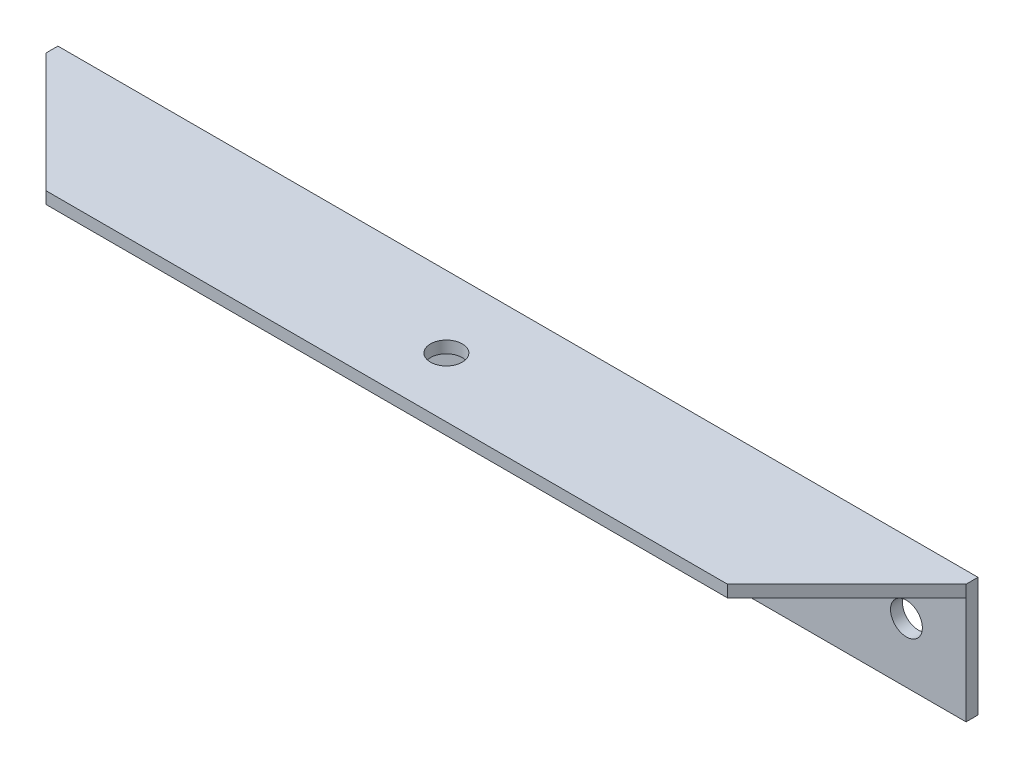
ISO-10303-21;
HEADER;
FILE_DESCRIPTION(('STEP AP214'),'2;1');
FILE_NAME('part.step','',(''),(''),'','','');
FILE_SCHEMA(('AUTOMOTIVE_DESIGN { 1 0 10303 214 1 1 1 1 }'));
ENDSEC;
DATA;
#1=APPLICATION_CONTEXT('core data for automotive mechanical design processes');
#2=APPLICATION_PROTOCOL_DEFINITION('international standard','automotive_design',2000,#1);
#3=PRODUCT_CONTEXT('',#1,'mechanical');
#4=PRODUCT('Part','Part','',(#3));
#5=PRODUCT_RELATED_PRODUCT_CATEGORY('part','',(#4));
#6=PRODUCT_DEFINITION_FORMATION('','',#4);
#7=PRODUCT_DEFINITION_CONTEXT('part definition',#1,'design');
#8=PRODUCT_DEFINITION('design','',#6,#7);
#9=PRODUCT_DEFINITION_SHAPE('','',#8);
#10=(LENGTH_UNIT() NAMED_UNIT(*) SI_UNIT(.MILLI.,.METRE.));
#11=(NAMED_UNIT(*) PLANE_ANGLE_UNIT() SI_UNIT($,.RADIAN.));
#12=(NAMED_UNIT(*) SI_UNIT($,.STERADIAN.) SOLID_ANGLE_UNIT());
#13=UNCERTAINTY_MEASURE_WITH_UNIT(LENGTH_MEASURE(1.E-05),#10,'distance_accuracy_value','');
#14=(GEOMETRIC_REPRESENTATION_CONTEXT(3) GLOBAL_UNCERTAINTY_ASSIGNED_CONTEXT((#13)) GLOBAL_UNIT_ASSIGNED_CONTEXT((#10,
#11,#12)) REPRESENTATION_CONTEXT('',''));
#15=CARTESIAN_POINT('',(0.,0.,0.));
#16=DIRECTION('',(0.,0.,1.));
#17=DIRECTION('',(1.,0.,0.));
#18=AXIS2_PLACEMENT_3D('',#15,#16,#17);
#19=CARTESIAN_POINT('',(115.7,0.,3.));
#20=DIRECTION('',(-1.,0.,0.));
#21=DIRECTION('',(0.,0.,1.));
#22=AXIS2_PLACEMENT_3D('',#19,#20,#21);
#23=PLANE('',#22);
#24=DIRECTION('',(0.,1.,0.));
#25=VECTOR('',#24,1.);
#26=CARTESIAN_POINT('',(115.7,0.,0.));
#27=LINE('',#26,#25);
#28=CARTESIAN_POINT('',(115.7,-30.,0.));
#29=VERTEX_POINT('',#28);
#30=CARTESIAN_POINT('',(115.7,0.,0.));
#31=VERTEX_POINT('',#30);
#32=EDGE_CURVE('E94',#29,#31,#27,.T.);
#33=ORIENTED_EDGE('',*,*,#32,.T.);
#34=DIRECTION('',(0.,0.,-1.));
#35=VECTOR('',#34,1.);
#36=CARTESIAN_POINT('',(115.7,0.,3.));
#37=LINE('',#36,#35);
#38=CARTESIAN_POINT('',(115.7,0.,3.));
#39=VERTEX_POINT('',#38);
#40=EDGE_CURVE('E11',#39,#31,#37,.T.);
#41=ORIENTED_EDGE('',*,*,#40,.F.);
#42=DIRECTION('',(0.,1.,0.));
#43=VECTOR('',#42,1.);
#44=CARTESIAN_POINT('',(115.7,-2.99999999999998,3.));
#45=LINE('',#44,#43);
#46=CARTESIAN_POINT('',(115.7,-2.99999999999998,3.));
#47=VERTEX_POINT('',#46);
#48=EDGE_CURVE('E99',#47,#39,#45,.T.);
#49=ORIENTED_EDGE('',*,*,#48,.F.);
#50=DIRECTION('',(0.,1.,0.));
#51=VECTOR('',#50,1.);
#52=CARTESIAN_POINT('',(115.7,0.,3.));
#53=LINE('',#52,#51);
#54=CARTESIAN_POINT('',(115.7,-30.,3.));
#55=VERTEX_POINT('',#54);
#56=EDGE_CURVE('E88',#55,#47,#53,.T.);
#57=ORIENTED_EDGE('',*,*,#56,.F.);
#58=DIRECTION('',(0.,0.,-1.));
#59=VECTOR('',#58,1.);
#60=CARTESIAN_POINT('',(115.7,-30.,3.));
#61=LINE('',#60,#59);
#62=EDGE_CURVE('E81',#55,#29,#61,.T.);
#63=ORIENTED_EDGE('',*,*,#62,.T.);
#64=EDGE_LOOP('',(#33,#41,#49,#57,#63));
#65=FACE_BOUND('',#64,.T.);
#66=ADVANCED_FACE('F35',(#65),#23,.F.);
#67=CARTESIAN_POINT('',(-115.7,0.,3.));
#68=DIRECTION('',(0.,-1.,0.));
#69=DIRECTION('',(1.,0.,0.));
#70=AXIS2_PLACEMENT_3D('',#67,#68,#69);
#71=PLANE('',#70);
#72=CARTESIAN_POINT('',(0.,0.,17.9999999999998));
#73=DIRECTION('',(0.,1.,0.));
#74=DIRECTION('',(0.,0.,1.));
#75=AXIS2_PLACEMENT_3D('',#72,#73,#74);
#76=CIRCLE('',#75,4.);
#77=CARTESIAN_POINT('',(0.,0.,21.9999999999998));
#78=VERTEX_POINT('',#77);
#79=EDGE_CURVE('E200',#78,#78,#76,.T.);
#80=ORIENTED_EDGE('',*,*,#79,.F.);
#81=EDGE_LOOP('',(#80));
#82=FACE_BOUND('',#81,.T.);
#83=DIRECTION('',(-1.,0.,0.));
#84=VECTOR('',#83,1.);
#85=CARTESIAN_POINT('',(-115.7,0.,0.));
#86=LINE('',#85,#84);
#87=CARTESIAN_POINT('',(-115.7,0.,0.));
#88=VERTEX_POINT('',#87);
#89=EDGE_CURVE('E98',#31,#88,#86,.T.);
#90=ORIENTED_EDGE('',*,*,#89,.T.);
#91=DIRECTION('',(0.,0.,-1.));
#92=VECTOR('',#91,1.);
#93=CARTESIAN_POINT('',(-115.7,0.,3.));
#94=LINE('',#93,#92);
#95=CARTESIAN_POINT('',(-115.7,0.,3.));
#96=VERTEX_POINT('',#95);
#97=EDGE_CURVE('E43',#96,#88,#94,.T.);
#98=ORIENTED_EDGE('',*,*,#97,.F.);
#99=DIRECTION('',(0.707106781186549,0.,0.707106781186546));
#100=VECTOR('',#99,1.);
#101=CARTESIAN_POINT('',(-115.7,0.,3.));
#102=LINE('',#101,#100);
#103=CARTESIAN_POINT('',(-85.7000000000001,0.,32.9999999999998));
#104=VERTEX_POINT('',#103);
#105=EDGE_CURVE('E124',#96,#104,#102,.T.);
#106=ORIENTED_EDGE('',*,*,#105,.T.);
#107=DIRECTION('',(1.,0.,0.));
#108=VECTOR('',#107,1.);
#109=CARTESIAN_POINT('',(-85.7000000000001,0.,32.9999999999998));
#110=LINE('',#109,#108);
#111=CARTESIAN_POINT('',(85.6999999999998,0.,32.9999999999998));
#112=VERTEX_POINT('',#111);
#113=EDGE_CURVE('E165',#104,#112,#110,.T.);
#114=ORIENTED_EDGE('',*,*,#113,.T.);
#115=DIRECTION('',(0.707106781186552,0.,-0.707106781186543));
#116=VECTOR('',#115,1.);
#117=CARTESIAN_POINT('',(115.7,0.,3.));
#118=LINE('',#117,#116);
#119=EDGE_CURVE('E147',#112,#39,#118,.T.);
#120=ORIENTED_EDGE('',*,*,#119,.T.);
#121=ORIENTED_EDGE('',*,*,#40,.T.);
#122=EDGE_LOOP('',(#90,#98,#106,#114,#120,#121));
#123=FACE_BOUND('',#122,.T.);
#124=ADVANCED_FACE('F120',(#82,#123),#71,.F.);
#125=CARTESIAN_POINT('',(-115.7,-30.,3.));
#126=DIRECTION('',(1.,0.,0.));
#127=DIRECTION('',(0.,0.,-1.));
#128=AXIS2_PLACEMENT_3D('',#125,#126,#127);
#129=PLANE('',#128);
#130=DIRECTION('',(0.,-1.,0.));
#131=VECTOR('',#130,1.);
#132=CARTESIAN_POINT('',(-115.7,-30.,0.));
#133=LINE('',#132,#131);
#134=CARTESIAN_POINT('',(-115.7,-30.,0.));
#135=VERTEX_POINT('',#134);
#136=EDGE_CURVE('E89',#88,#135,#133,.T.);
#137=ORIENTED_EDGE('',*,*,#136,.T.);
#138=DIRECTION('',(0.,0.,-1.));
#139=VECTOR('',#138,1.);
#140=CARTESIAN_POINT('',(-115.7,-30.,3.));
#141=LINE('',#140,#139);
#142=CARTESIAN_POINT('',(-115.7,-30.,3.));
#143=VERTEX_POINT('',#142);
#144=EDGE_CURVE('E84',#143,#135,#141,.T.);
#145=ORIENTED_EDGE('',*,*,#144,.F.);
#146=DIRECTION('',(0.,-1.,0.));
#147=VECTOR('',#146,1.);
#148=CARTESIAN_POINT('',(-115.7,-30.,3.));
#149=LINE('',#148,#147);
#150=CARTESIAN_POINT('',(-115.7,-3.00000000000001,3.));
#151=VERTEX_POINT('',#150);
#152=EDGE_CURVE('E170',#151,#143,#149,.T.);
#153=ORIENTED_EDGE('',*,*,#152,.F.);
#154=EDGE_CURVE('E117',#96,#151,#149,.T.);
#155=ORIENTED_EDGE('',*,*,#154,.F.);
#156=ORIENTED_EDGE('',*,*,#97,.T.);
#157=EDGE_LOOP('',(#137,#145,#153,#155,#156));
#158=FACE_BOUND('',#157,.T.);
#159=ADVANCED_FACE('F114',(#158),#129,.F.);
#160=CARTESIAN_POINT('',(115.7,-30.,3.));
#161=DIRECTION('',(0.,1.,0.));
#162=DIRECTION('',(0.,0.,1.));
#163=AXIS2_PLACEMENT_3D('',#160,#161,#162);
#164=PLANE('',#163);
#165=DIRECTION('',(1.,0.,0.));
#166=VECTOR('',#165,1.);
#167=CARTESIAN_POINT('',(115.7,-30.,0.));
#168=LINE('',#167,#166);
#169=EDGE_CURVE('E78',#135,#29,#168,.T.);
#170=ORIENTED_EDGE('',*,*,#169,.T.);
#171=ORIENTED_EDGE('',*,*,#62,.F.);
#172=DIRECTION('',(1.,0.,0.));
#173=VECTOR('',#172,1.);
#174=CARTESIAN_POINT('',(115.7,-30.,3.));
#175=LINE('',#174,#173);
#176=EDGE_CURVE('E59',#143,#55,#175,.T.);
#177=ORIENTED_EDGE('',*,*,#176,.F.);
#178=ORIENTED_EDGE('',*,*,#144,.T.);
#179=EDGE_LOOP('',(#170,#171,#177,#178));
#180=FACE_BOUND('',#179,.T.);
#181=ADVANCED_FACE('F80',(#180),#164,.F.);
#182=CARTESIAN_POINT('',(0.,0.,3.));
#183=DIRECTION('',(0.,0.,-1.));
#184=DIRECTION('',(-1.,0.,0.));
#185=AXIS2_PLACEMENT_3D('',#182,#183,#184);
#186=PLANE('',#185);
#187=CARTESIAN_POINT('',(62.4999999999999,-15.0000000000001,3.));
#188=DIRECTION('',(0.,0.,1.));
#189=DIRECTION('',(1.,0.,0.));
#190=AXIS2_PLACEMENT_3D('',#187,#188,#189);
#191=CIRCLE('',#190,5.);
#192=CARTESIAN_POINT('',(67.4999999999999,-15.0000000000001,3.));
#193=VERTEX_POINT('',#192);
#194=EDGE_CURVE('E207',#193,#193,#191,.T.);
#195=ORIENTED_EDGE('',*,*,#194,.F.);
#196=EDGE_LOOP('',(#195));
#197=FACE_BOUND('',#196,.T.);
#198=CARTESIAN_POINT('',(-100.7,-15.,3.));
#199=DIRECTION('',(0.,0.,1.));
#200=DIRECTION('',(1.,0.,0.));
#201=AXIS2_PLACEMENT_3D('',#198,#199,#200);
#202=CIRCLE('',#201,4.);
#203=CARTESIAN_POINT('',(-96.7000000000005,-15.,3.));
#204=VERTEX_POINT('',#203);
#205=EDGE_CURVE('E205',#204,#204,#202,.T.);
#206=ORIENTED_EDGE('',*,*,#205,.F.);
#207=EDGE_LOOP('',(#206));
#208=FACE_BOUND('',#207,.T.);
#209=CARTESIAN_POINT('',(100.700000000001,-15.,3.));
#210=DIRECTION('',(0.,0.,1.));
#211=DIRECTION('',(1.,0.,0.));
#212=AXIS2_PLACEMENT_3D('',#209,#210,#211);
#213=CIRCLE('',#212,4.);
#214=CARTESIAN_POINT('',(104.700000000001,-15.,3.));
#215=VERTEX_POINT('',#214);
#216=EDGE_CURVE('E216',#215,#215,#213,.T.);
#217=ORIENTED_EDGE('',*,*,#216,.F.);
#218=EDGE_LOOP('',(#217));
#219=FACE_BOUND('',#218,.T.);
#220=ORIENTED_EDGE('',*,*,#56,.T.);
#221=DIRECTION('',(-1.,0.,0.));
#222=VECTOR('',#221,1.);
#223=CARTESIAN_POINT('',(-115.7,-3.00000000000002,3.));
#224=LINE('',#223,#222);
#225=EDGE_CURVE('E156',#47,#151,#224,.T.);
#226=ORIENTED_EDGE('',*,*,#225,.T.);
#227=ORIENTED_EDGE('',*,*,#152,.T.);
#228=ORIENTED_EDGE('',*,*,#176,.T.);
#229=EDGE_LOOP('',(#220,#226,#227,#228));
#230=FACE_BOUND('',#229,.T.);
#231=ADVANCED_FACE('F171',(#197,#208,#219,#230),#186,.F.);
#232=CARTESIAN_POINT('',(0.,0.,0.));
#233=DIRECTION('',(0.,0.,-1.));
#234=DIRECTION('',(-1.,0.,0.));
#235=AXIS2_PLACEMENT_3D('',#232,#233,#234);
#236=PLANE('',#235);
#237=CARTESIAN_POINT('',(62.4999999999999,-15.0000000000001,0.));
#238=DIRECTION('',(0.,0.,1.));
#239=DIRECTION('',(1.,0.,0.));
#240=AXIS2_PLACEMENT_3D('',#237,#238,#239);
#241=CIRCLE('',#240,5.);
#242=CARTESIAN_POINT('',(67.4999999999999,-15.0000000000001,0.));
#243=VERTEX_POINT('',#242);
#244=EDGE_CURVE('E202',#243,#243,#241,.T.);
#245=ORIENTED_EDGE('',*,*,#244,.T.);
#246=EDGE_LOOP('',(#245));
#247=FACE_BOUND('',#246,.T.);
#248=CARTESIAN_POINT('',(-100.7,-15.,0.));
#249=DIRECTION('',(0.,0.,1.));
#250=DIRECTION('',(1.,0.,0.));
#251=AXIS2_PLACEMENT_3D('',#248,#249,#250);
#252=CIRCLE('',#251,4.);
#253=CARTESIAN_POINT('',(-96.7000000000005,-15.,0.));
#254=VERTEX_POINT('',#253);
#255=EDGE_CURVE('E213',#254,#254,#252,.T.);
#256=ORIENTED_EDGE('',*,*,#255,.T.);
#257=EDGE_LOOP('',(#256));
#258=FACE_BOUND('',#257,.T.);
#259=CARTESIAN_POINT('',(100.700000000001,-15.,0.));
#260=DIRECTION('',(0.,0.,1.));
#261=DIRECTION('',(1.,0.,0.));
#262=AXIS2_PLACEMENT_3D('',#259,#260,#261);
#263=CIRCLE('',#262,4.);
#264=CARTESIAN_POINT('',(104.700000000001,-15.,0.));
#265=VERTEX_POINT('',#264);
#266=EDGE_CURVE('E166',#265,#265,#263,.T.);
#267=ORIENTED_EDGE('',*,*,#266,.T.);
#268=EDGE_LOOP('',(#267));
#269=FACE_BOUND('',#268,.T.);
#270=ORIENTED_EDGE('',*,*,#32,.F.);
#271=ORIENTED_EDGE('',*,*,#169,.F.);
#272=ORIENTED_EDGE('',*,*,#136,.F.);
#273=ORIENTED_EDGE('',*,*,#89,.F.);
#274=EDGE_LOOP('',(#270,#271,#272,#273));
#275=FACE_BOUND('',#274,.T.);
#276=ADVANCED_FACE('F97',(#247,#258,#269,#275),#236,.T.);
#277=CARTESIAN_POINT('',(-115.7,-3.00000000000002,3.));
#278=DIRECTION('',(-0.707106781186546,0.,0.707106781186549));
#279=DIRECTION('',(0.707106781186549,0.,0.707106781186546));
#280=AXIS2_PLACEMENT_3D('',#277,#278,#279);
#281=PLANE('',#280);
#282=ORIENTED_EDGE('',*,*,#105,.F.);
#283=ORIENTED_EDGE('',*,*,#154,.T.);
#284=DIRECTION('',(0.707106781186549,0.,0.707106781186546));
#285=VECTOR('',#284,1.);
#286=CARTESIAN_POINT('',(-115.7,-3.00000000000002,3.));
#287=LINE('',#286,#285);
#288=CARTESIAN_POINT('',(-85.7000000000001,-3.00000000000002,32.9999999999998));
#289=VERTEX_POINT('',#288);
#290=EDGE_CURVE('E50',#151,#289,#287,.T.);
#291=ORIENTED_EDGE('',*,*,#290,.T.);
#292=DIRECTION('',(0.,1.,0.));
#293=VECTOR('',#292,1.);
#294=CARTESIAN_POINT('',(-85.7000000000001,-3.00000000000002,32.9999999999998));
#295=LINE('',#294,#293);
#296=EDGE_CURVE('E151',#289,#104,#295,.T.);
#297=ORIENTED_EDGE('',*,*,#296,.T.);
#298=EDGE_LOOP('',(#282,#283,#291,#297));
#299=FACE_BOUND('',#298,.T.);
#300=ADVANCED_FACE('F179',(#299),#281,.T.);
#301=CARTESIAN_POINT('',(115.7,-2.99999999999998,3.));
#302=DIRECTION('',(0.707106781186543,0.,0.707106781186552));
#303=DIRECTION('',(0.707106781186552,0.,-0.707106781186543));
#304=AXIS2_PLACEMENT_3D('',#301,#302,#303);
#305=PLANE('',#304);
#306=ORIENTED_EDGE('',*,*,#119,.F.);
#307=DIRECTION('',(0.,1.,0.));
#308=VECTOR('',#307,1.);
#309=CARTESIAN_POINT('',(85.6999999999998,-2.99999999999998,32.9999999999998));
#310=LINE('',#309,#308);
#311=CARTESIAN_POINT('',(85.6999999999998,-2.99999999999998,32.9999999999998));
#312=VERTEX_POINT('',#311);
#313=EDGE_CURVE('E103',#312,#112,#310,.T.);
#314=ORIENTED_EDGE('',*,*,#313,.F.);
#315=DIRECTION('',(0.707106781186552,0.,-0.707106781186543));
#316=VECTOR('',#315,1.);
#317=CARTESIAN_POINT('',(115.7,-2.99999999999998,3.));
#318=LINE('',#317,#316);
#319=EDGE_CURVE('E145',#312,#47,#318,.T.);
#320=ORIENTED_EDGE('',*,*,#319,.T.);
#321=ORIENTED_EDGE('',*,*,#48,.T.);
#322=EDGE_LOOP('',(#306,#314,#320,#321));
#323=FACE_BOUND('',#322,.T.);
#324=ADVANCED_FACE('F144',(#323),#305,.T.);
#325=CARTESIAN_POINT('',(-85.7000000000001,-3.00000000000002,32.9999999999998));
#326=DIRECTION('',(0.,0.,1.));
#327=DIRECTION('',(1.,0.,0.));
#328=AXIS2_PLACEMENT_3D('',#325,#326,#327);
#329=PLANE('',#328);
#330=ORIENTED_EDGE('',*,*,#113,.F.);
#331=ORIENTED_EDGE('',*,*,#296,.F.);
#332=DIRECTION('',(1.,0.,0.));
#333=VECTOR('',#332,1.);
#334=CARTESIAN_POINT('',(-85.7000000000001,-3.00000000000002,32.9999999999998));
#335=LINE('',#334,#333);
#336=EDGE_CURVE('E154',#289,#312,#335,.T.);
#337=ORIENTED_EDGE('',*,*,#336,.T.);
#338=ORIENTED_EDGE('',*,*,#313,.T.);
#339=EDGE_LOOP('',(#330,#331,#337,#338));
#340=FACE_BOUND('',#339,.T.);
#341=ADVANCED_FACE('F158',(#340),#329,.T.);
#342=CARTESIAN_POINT('',(0.,-3.,0.));
#343=DIRECTION('',(0.,-1.,0.));
#344=DIRECTION('',(1.,0.,0.));
#345=AXIS2_PLACEMENT_3D('',#342,#343,#344);
#346=PLANE('',#345);
#347=CARTESIAN_POINT('',(0.,-3.,17.9999999999998));
#348=DIRECTION('',(0.,-1.,0.));
#349=DIRECTION('',(1.,0.,0.));
#350=AXIS2_PLACEMENT_3D('',#347,#348,#349);
#351=CIRCLE('',#350,3.99999999999999);
#352=CARTESIAN_POINT('',(3.99999999999999,-3.,17.9999999999998));
#353=VERTEX_POINT('',#352);
#354=EDGE_CURVE('E38',#353,#353,#351,.T.);
#355=ORIENTED_EDGE('',*,*,#354,.F.);
#356=EDGE_LOOP('',(#355));
#357=FACE_BOUND('',#356,.T.);
#358=ORIENTED_EDGE('',*,*,#290,.F.);
#359=ORIENTED_EDGE('',*,*,#225,.F.);
#360=ORIENTED_EDGE('',*,*,#319,.F.);
#361=ORIENTED_EDGE('',*,*,#336,.F.);
#362=EDGE_LOOP('',(#358,#359,#360,#361));
#363=FACE_BOUND('',#362,.T.);
#364=ADVANCED_FACE('F153',(#357,#363),#346,.T.);
#365=CARTESIAN_POINT('',(100.700000000001,-15.,3.));
#366=DIRECTION('',(0.,0.,1.));
#367=DIRECTION('',(1.,0.,0.));
#368=AXIS2_PLACEMENT_3D('',#365,#366,#367);
#369=CYLINDRICAL_SURFACE('',#368,4.);
#370=ORIENTED_EDGE('',*,*,#266,.F.);
#371=EDGE_LOOP('',(#370));
#372=FACE_BOUND('',#371,.T.);
#373=ORIENTED_EDGE('',*,*,#216,.T.);
#374=EDGE_LOOP('',(#373));
#375=FACE_BOUND('',#374,.T.);
#376=ADVANCED_FACE('F222',(#372,#375),#369,.F.);
#377=CARTESIAN_POINT('',(-100.7,-15.,3.));
#378=DIRECTION('',(0.,0.,1.));
#379=DIRECTION('',(1.,0.,0.));
#380=AXIS2_PLACEMENT_3D('',#377,#378,#379);
#381=CYLINDRICAL_SURFACE('',#380,4.);
#382=ORIENTED_EDGE('',*,*,#255,.F.);
#383=EDGE_LOOP('',(#382));
#384=FACE_BOUND('',#383,.T.);
#385=ORIENTED_EDGE('',*,*,#205,.T.);
#386=EDGE_LOOP('',(#385));
#387=FACE_BOUND('',#386,.T.);
#388=ADVANCED_FACE('F225',(#384,#387),#381,.F.);
#389=CARTESIAN_POINT('',(0.,0.,17.9999999999998));
#390=DIRECTION('',(0.,1.,0.));
#391=DIRECTION('',(0.,0.,1.));
#392=AXIS2_PLACEMENT_3D('',#389,#390,#391);
#393=CYLINDRICAL_SURFACE('',#392,3.99999999999999);
#394=ORIENTED_EDGE('',*,*,#354,.T.);
#395=EDGE_LOOP('',(#394));
#396=FACE_BOUND('',#395,.T.);
#397=ORIENTED_EDGE('',*,*,#79,.T.);
#398=EDGE_LOOP('',(#397));
#399=FACE_BOUND('',#398,.T.);
#400=ADVANCED_FACE('F233',(#396,#399),#393,.F.);
#401=CARTESIAN_POINT('',(62.4999999999999,-15.0000000000001,3.));
#402=DIRECTION('',(0.,0.,1.));
#403=DIRECTION('',(1.,0.,0.));
#404=AXIS2_PLACEMENT_3D('',#401,#402,#403);
#405=CYLINDRICAL_SURFACE('',#404,5.);
#406=ORIENTED_EDGE('',*,*,#244,.F.);
#407=EDGE_LOOP('',(#406));
#408=FACE_BOUND('',#407,.T.);
#409=ORIENTED_EDGE('',*,*,#194,.T.);
#410=EDGE_LOOP('',(#409));
#411=FACE_BOUND('',#410,.T.);
#412=ADVANCED_FACE('F271',(#408,#411),#405,.F.);
#413=CLOSED_SHELL('',(#66,#124,#159,#181,#231,#276,#300,#324,#341,#364,#376,#388,#400,#412));
#414=MANIFOLD_SOLID_BREP('B2',#413);
#415=ADVANCED_BREP_SHAPE_REPRESENTATION('',(#18,#414),#14);
#416=SHAPE_DEFINITION_REPRESENTATION(#9,#415);
ENDSEC;
END-ISO-10303-21;
